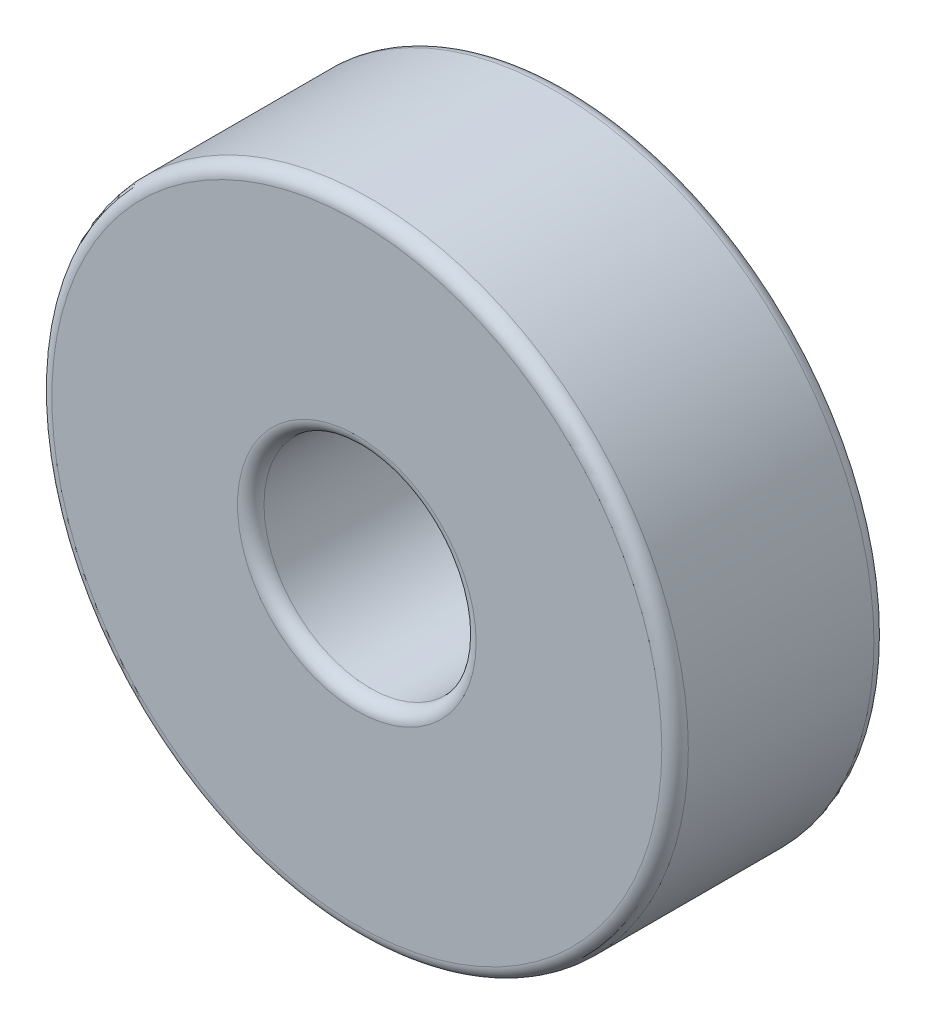
ISO-10303-21;
HEADER;
FILE_DESCRIPTION(('STEP AP214'),'2;1');
FILE_NAME('part.step','',(''),(''),'','','');
FILE_SCHEMA(('AUTOMOTIVE_DESIGN { 1 0 10303 214 1 1 1 1 }'));
ENDSEC;
DATA;
#1=APPLICATION_CONTEXT('core data for automotive mechanical design processes');
#2=APPLICATION_PROTOCOL_DEFINITION('international standard','automotive_design',2000,#1);
#3=PRODUCT_CONTEXT('',#1,'mechanical');
#4=PRODUCT('Part','Part','',(#3));
#5=PRODUCT_RELATED_PRODUCT_CATEGORY('part','',(#4));
#6=PRODUCT_DEFINITION_FORMATION('','',#4);
#7=PRODUCT_DEFINITION_CONTEXT('part definition',#1,'design');
#8=PRODUCT_DEFINITION('design','',#6,#7);
#9=PRODUCT_DEFINITION_SHAPE('','',#8);
#10=(LENGTH_UNIT() NAMED_UNIT(*) SI_UNIT(.MILLI.,.METRE.));
#11=(NAMED_UNIT(*) PLANE_ANGLE_UNIT() SI_UNIT($,.RADIAN.));
#12=(NAMED_UNIT(*) SI_UNIT($,.STERADIAN.) SOLID_ANGLE_UNIT());
#13=UNCERTAINTY_MEASURE_WITH_UNIT(LENGTH_MEASURE(1.E-05),#10,'distance_accuracy_value','');
#14=(GEOMETRIC_REPRESENTATION_CONTEXT(3) GLOBAL_UNCERTAINTY_ASSIGNED_CONTEXT((#13)) GLOBAL_UNIT_ASSIGNED_CONTEXT((#10,
#11,#12)) REPRESENTATION_CONTEXT('',''));
#15=CARTESIAN_POINT('',(0.,0.,0.));
#16=DIRECTION('',(0.,0.,1.));
#17=DIRECTION('',(1.,0.,0.));
#18=AXIS2_PLACEMENT_3D('',#15,#16,#17);
#19=CARTESIAN_POINT('',(0.,0.,8.));
#20=DIRECTION('',(0.,0.,1.));
#21=DIRECTION('',(1.,0.,0.));
#22=AXIS2_PLACEMENT_3D('',#19,#20,#21);
#23=PLANE('',#22);
#24=CARTESIAN_POINT('',(0.,0.,8.));
#25=DIRECTION('',(0.,0.,1.));
#26=DIRECTION('',(1.,0.,0.));
#27=AXIS2_PLACEMENT_3D('',#24,#25,#26);
#28=CIRCLE('',#27,4.5);
#29=CARTESIAN_POINT('',(4.5,0.,8.));
#30=VERTEX_POINT('',#29);
#31=EDGE_CURVE('E53',#30,#30,#28,.F.);
#32=ORIENTED_EDGE('',*,*,#31,.T.);
#33=EDGE_LOOP('',(#32));
#34=FACE_BOUND('',#33,.T.);
#35=CARTESIAN_POINT('',(0.,0.,8.));
#36=DIRECTION('',(0.,0.,1.));
#37=DIRECTION('',(1.,0.,0.));
#38=AXIS2_PLACEMENT_3D('',#35,#36,#37);
#39=CIRCLE('',#38,11.5);
#40=CARTESIAN_POINT('',(11.5,0.,8.));
#41=VERTEX_POINT('',#40);
#42=EDGE_CURVE('E56',#41,#41,#39,.T.);
#43=ORIENTED_EDGE('',*,*,#42,.T.);
#44=EDGE_LOOP('',(#43));
#45=FACE_BOUND('',#44,.T.);
#46=ADVANCED_FACE('F33',(#34,#45),#23,.T.);
#47=CARTESIAN_POINT('',(0.,0.,0.));
#48=DIRECTION('',(0.,0.,1.));
#49=DIRECTION('',(1.,0.,0.));
#50=AXIS2_PLACEMENT_3D('',#47,#48,#49);
#51=PLANE('',#50);
#52=CARTESIAN_POINT('',(0.,0.,0.));
#53=DIRECTION('',(0.,0.,1.));
#54=DIRECTION('',(1.,0.,0.));
#55=AXIS2_PLACEMENT_3D('',#52,#53,#54);
#56=CIRCLE('',#55,4.5);
#57=CARTESIAN_POINT('',(4.5,0.,0.));
#58=VERTEX_POINT('',#57);
#59=EDGE_CURVE('E44',#58,#58,#56,.T.);
#60=ORIENTED_EDGE('',*,*,#59,.T.);
#61=EDGE_LOOP('',(#60));
#62=FACE_BOUND('',#61,.T.);
#63=CARTESIAN_POINT('',(0.,0.,0.));
#64=DIRECTION('',(0.,0.,1.));
#65=DIRECTION('',(1.,0.,0.));
#66=AXIS2_PLACEMENT_3D('',#63,#64,#65);
#67=CIRCLE('',#66,11.5);
#68=CARTESIAN_POINT('',(11.5,0.,0.));
#69=VERTEX_POINT('',#68);
#70=EDGE_CURVE('E48',#69,#69,#67,.F.);
#71=ORIENTED_EDGE('',*,*,#70,.T.);
#72=EDGE_LOOP('',(#71));
#73=FACE_BOUND('',#72,.T.);
#74=ADVANCED_FACE('F76',(#62,#73),#51,.F.);
#75=CARTESIAN_POINT('',(0.,0.,8.));
#76=DIRECTION('',(0.,0.,-1.));
#77=DIRECTION('',(-1.,0.,0.));
#78=AXIS2_PLACEMENT_3D('',#75,#76,#77);
#79=CYLINDRICAL_SURFACE('',#78,12.);
#80=CARTESIAN_POINT('',(0.,0.,0.5));
#81=DIRECTION('',(0.,0.,1.));
#82=DIRECTION('',(1.,0.,0.));
#83=AXIS2_PLACEMENT_3D('',#80,#81,#82);
#84=CIRCLE('',#83,12.);
#85=CARTESIAN_POINT('',(12.,0.,0.5));
#86=VERTEX_POINT('',#85);
#87=EDGE_CURVE('E10',#86,#86,#84,.T.);
#88=ORIENTED_EDGE('',*,*,#87,.T.);
#89=EDGE_LOOP('',(#88));
#90=FACE_BOUND('',#89,.T.);
#91=CARTESIAN_POINT('',(0.,0.,7.5));
#92=DIRECTION('',(0.,0.,1.));
#93=DIRECTION('',(1.,0.,0.));
#94=AXIS2_PLACEMENT_3D('',#91,#92,#93);
#95=CIRCLE('',#94,12.);
#96=CARTESIAN_POINT('',(12.,0.,7.5));
#97=VERTEX_POINT('',#96);
#98=EDGE_CURVE('E40',#97,#97,#95,.F.);
#99=ORIENTED_EDGE('',*,*,#98,.T.);
#100=EDGE_LOOP('',(#99));
#101=FACE_BOUND('',#100,.T.);
#102=ADVANCED_FACE('F79',(#90,#101),#79,.T.);
#103=CARTESIAN_POINT('',(0.,0.,8.));
#104=DIRECTION('',(0.,0.,-1.));
#105=DIRECTION('',(-1.,0.,0.));
#106=AXIS2_PLACEMENT_3D('',#103,#104,#105);
#107=CYLINDRICAL_SURFACE('',#106,4.);
#108=CARTESIAN_POINT('',(0.,0.,7.5));
#109=DIRECTION('',(0.,0.,1.));
#110=DIRECTION('',(1.,0.,0.));
#111=AXIS2_PLACEMENT_3D('',#108,#109,#110);
#112=CIRCLE('',#111,4.);
#113=CARTESIAN_POINT('',(4.,0.,7.5));
#114=VERTEX_POINT('',#113);
#115=EDGE_CURVE('E59',#114,#114,#112,.T.);
#116=ORIENTED_EDGE('',*,*,#115,.T.);
#117=EDGE_LOOP('',(#116));
#118=FACE_BOUND('',#117,.T.);
#119=CARTESIAN_POINT('',(0.,0.,0.5));
#120=DIRECTION('',(0.,0.,1.));
#121=DIRECTION('',(1.,0.,0.));
#122=AXIS2_PLACEMENT_3D('',#119,#120,#121);
#123=CIRCLE('',#122,4.);
#124=CARTESIAN_POINT('',(4.,0.,0.5));
#125=VERTEX_POINT('',#124);
#126=EDGE_CURVE('E62',#125,#125,#123,.F.);
#127=ORIENTED_EDGE('',*,*,#126,.T.);
#128=EDGE_LOOP('',(#127));
#129=FACE_BOUND('',#128,.T.);
#130=ADVANCED_FACE('F66',(#118,#129),#107,.F.);
#131=CARTESIAN_POINT('',(0.,0.,7.5));
#132=DIRECTION('',(0.,0.,1.));
#133=DIRECTION('',(1.,0.,0.));
#134=AXIS2_PLACEMENT_3D('',#131,#132,#133);
#135=TOROIDAL_SURFACE('',#134,4.5,0.5);
#136=ORIENTED_EDGE('',*,*,#31,.F.);
#137=EDGE_LOOP('',(#136));
#138=FACE_BOUND('',#137,.T.);
#139=ORIENTED_EDGE('',*,*,#115,.F.);
#140=EDGE_LOOP('',(#139));
#141=FACE_BOUND('',#140,.T.);
#142=ADVANCED_FACE('F72',(#138,#141),#135,.T.);
#143=CARTESIAN_POINT('',(0.,0.,0.5));
#144=DIRECTION('',(0.,0.,1.));
#145=DIRECTION('',(1.,0.,0.));
#146=AXIS2_PLACEMENT_3D('',#143,#144,#145);
#147=TOROIDAL_SURFACE('',#146,4.5,0.5);
#148=ORIENTED_EDGE('',*,*,#126,.F.);
#149=EDGE_LOOP('',(#148));
#150=FACE_BOUND('',#149,.T.);
#151=ORIENTED_EDGE('',*,*,#59,.F.);
#152=EDGE_LOOP('',(#151));
#153=FACE_BOUND('',#152,.T.);
#154=ADVANCED_FACE('F68',(#150,#153),#147,.T.);
#155=CARTESIAN_POINT('',(0.,0.,0.5));
#156=DIRECTION('',(0.,0.,1.));
#157=DIRECTION('',(1.,0.,0.));
#158=AXIS2_PLACEMENT_3D('',#155,#156,#157);
#159=TOROIDAL_SURFACE('',#158,11.5,0.5);
#160=ORIENTED_EDGE('',*,*,#70,.F.);
#161=EDGE_LOOP('',(#160));
#162=FACE_BOUND('',#161,.T.);
#163=ORIENTED_EDGE('',*,*,#87,.F.);
#164=EDGE_LOOP('',(#163));
#165=FACE_BOUND('',#164,.T.);
#166=ADVANCED_FACE('F71',(#162,#165),#159,.T.);
#167=CARTESIAN_POINT('',(0.,0.,7.5));
#168=DIRECTION('',(0.,0.,1.));
#169=DIRECTION('',(1.,0.,0.));
#170=AXIS2_PLACEMENT_3D('',#167,#168,#169);
#171=TOROIDAL_SURFACE('',#170,11.5,0.5);
#172=ORIENTED_EDGE('',*,*,#98,.F.);
#173=EDGE_LOOP('',(#172));
#174=FACE_BOUND('',#173,.T.);
#175=ORIENTED_EDGE('',*,*,#42,.F.);
#176=EDGE_LOOP('',(#175));
#177=FACE_BOUND('',#176,.T.);
#178=ADVANCED_FACE('F35',(#174,#177),#171,.T.);
#179=CLOSED_SHELL('',(#46,#74,#102,#130,#142,#154,#166,#178));
#180=MANIFOLD_SOLID_BREP('B2',#179);
#181=ADVANCED_BREP_SHAPE_REPRESENTATION('',(#18,#180),#14);
#182=SHAPE_DEFINITION_REPRESENTATION(#9,#181);
ENDSEC;
END-ISO-10303-21;
